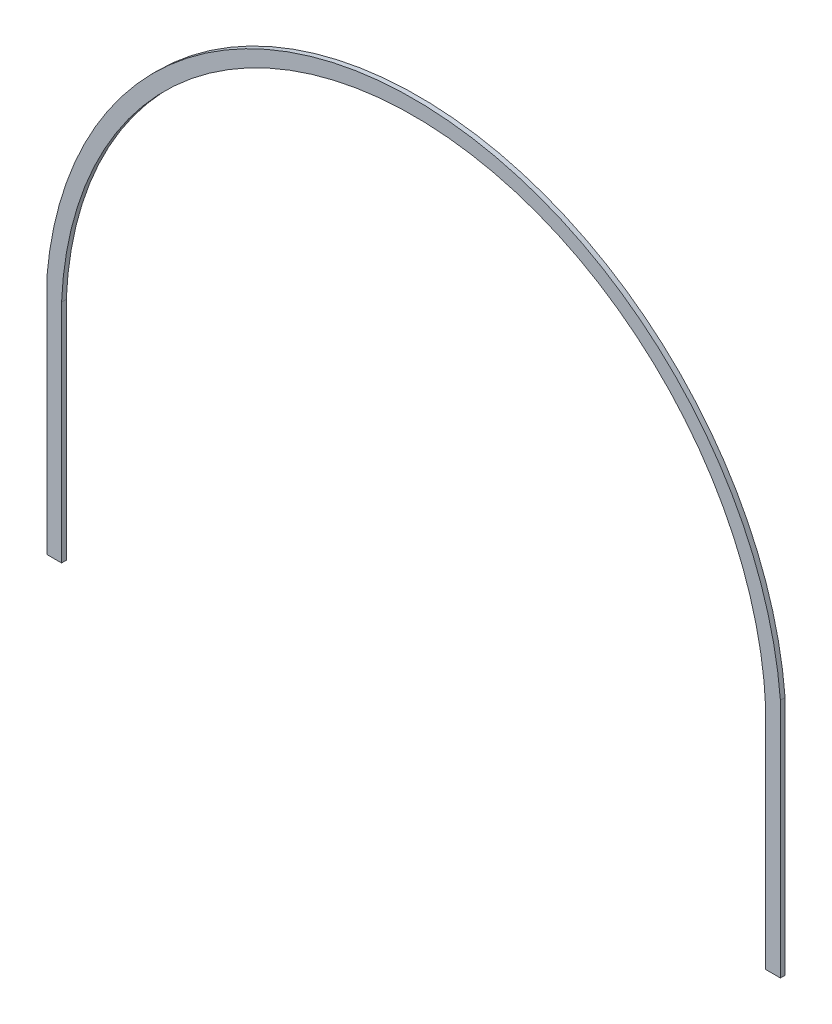
ISO-10303-21;
HEADER;
FILE_DESCRIPTION(('STEP AP214'),'2;1');
FILE_NAME('part.step','',(''),(''),'','','');
FILE_SCHEMA(('AUTOMOTIVE_DESIGN { 1 0 10303 214 1 1 1 1 }'));
ENDSEC;
DATA;
#1=APPLICATION_CONTEXT('core data for automotive mechanical design processes');
#2=APPLICATION_PROTOCOL_DEFINITION('international standard','automotive_design',2000,#1);
#3=PRODUCT_CONTEXT('',#1,'mechanical');
#4=PRODUCT('Part','Part','',(#3));
#5=PRODUCT_RELATED_PRODUCT_CATEGORY('part','',(#4));
#6=PRODUCT_DEFINITION_FORMATION('','',#4);
#7=PRODUCT_DEFINITION_CONTEXT('part definition',#1,'design');
#8=PRODUCT_DEFINITION('design','',#6,#7);
#9=PRODUCT_DEFINITION_SHAPE('','',#8);
#10=(LENGTH_UNIT() NAMED_UNIT(*) SI_UNIT(.MILLI.,.METRE.));
#11=(NAMED_UNIT(*) PLANE_ANGLE_UNIT() SI_UNIT($,.RADIAN.));
#12=(NAMED_UNIT(*) SI_UNIT($,.STERADIAN.) SOLID_ANGLE_UNIT());
#13=UNCERTAINTY_MEASURE_WITH_UNIT(LENGTH_MEASURE(1.E-05),#10,'distance_accuracy_value','');
#14=(GEOMETRIC_REPRESENTATION_CONTEXT(3) GLOBAL_UNCERTAINTY_ASSIGNED_CONTEXT((#13)) GLOBAL_UNIT_ASSIGNED_CONTEXT((#10,
#11,#12)) REPRESENTATION_CONTEXT('',''));
#15=CARTESIAN_POINT('',(0.,0.,0.));
#16=DIRECTION('',(0.,0.,1.));
#17=DIRECTION('',(1.,0.,0.));
#18=AXIS2_PLACEMENT_3D('',#15,#16,#17);
#19=CARTESIAN_POINT('',(0.,0.,1.6));
#20=DIRECTION('',(1.,0.,0.));
#21=DIRECTION('',(0.,0.,-1.));
#22=AXIS2_PLACEMENT_3D('',#19,#20,#21);
#23=PLANE('',#22);
#24=DIRECTION('',(0.,-1.,0.));
#25=VECTOR('',#24,1.);
#26=CARTESIAN_POINT('',(0.,0.,0.));
#27=LINE('',#26,#25);
#28=CARTESIAN_POINT('',(0.,82.,0.));
#29=VERTEX_POINT('',#28);
#30=CARTESIAN_POINT('',(0.,0.,0.));
#31=VERTEX_POINT('',#30);
#32=EDGE_CURVE('E142',#29,#31,#27,.T.);
#33=ORIENTED_EDGE('',*,*,#32,.T.);
#34=DIRECTION('',(0.,0.,-1.));
#35=VECTOR('',#34,1.);
#36=CARTESIAN_POINT('',(0.,0.,1.6));
#37=LINE('',#36,#35);
#38=CARTESIAN_POINT('',(0.,0.,1.6));
#39=VERTEX_POINT('',#38);
#40=EDGE_CURVE('E11',#39,#31,#37,.T.);
#41=ORIENTED_EDGE('',*,*,#40,.F.);
#42=DIRECTION('',(0.,-1.,0.));
#43=VECTOR('',#42,1.);
#44=CARTESIAN_POINT('',(0.,0.,1.6));
#45=LINE('',#44,#43);
#46=CARTESIAN_POINT('',(0.,82.,1.6));
#47=VERTEX_POINT('',#46);
#48=EDGE_CURVE('E164',#47,#39,#45,.T.);
#49=ORIENTED_EDGE('',*,*,#48,.F.);
#50=DIRECTION('',(0.,0.,-1.));
#51=VECTOR('',#50,1.);
#52=CARTESIAN_POINT('',(0.,82.,1.6));
#53=LINE('',#52,#51);
#54=EDGE_CURVE('E138',#47,#29,#53,.T.);
#55=ORIENTED_EDGE('',*,*,#54,.T.);
#56=EDGE_LOOP('',(#33,#41,#49,#55));
#57=FACE_BOUND('',#56,.T.);
#58=ADVANCED_FACE('F40',(#57),#23,.F.);
#59=CARTESIAN_POINT('',(0.,0.,1.6));
#60=DIRECTION('',(0.,1.,0.));
#61=DIRECTION('',(0.,0.,1.));
#62=AXIS2_PLACEMENT_3D('',#59,#60,#61);
#63=PLANE('',#62);
#64=DIRECTION('',(1.,0.,0.));
#65=VECTOR('',#64,1.);
#66=CARTESIAN_POINT('',(0.,0.,0.));
#67=LINE('',#66,#65);
#68=CARTESIAN_POINT('',(5.,0.,0.));
#69=VERTEX_POINT('',#68);
#70=EDGE_CURVE('E146',#31,#69,#67,.T.);
#71=ORIENTED_EDGE('',*,*,#70,.T.);
#72=DIRECTION('',(0.,0.,-1.));
#73=VECTOR('',#72,1.);
#74=CARTESIAN_POINT('',(5.,0.,1.6));
#75=LINE('',#74,#73);
#76=CARTESIAN_POINT('',(5.,0.,1.6));
#77=VERTEX_POINT('',#76);
#78=EDGE_CURVE('E49',#77,#69,#75,.T.);
#79=ORIENTED_EDGE('',*,*,#78,.F.);
#80=DIRECTION('',(1.,0.,0.));
#81=VECTOR('',#80,1.);
#82=CARTESIAN_POINT('',(0.,0.,1.6));
#83=LINE('',#82,#81);
#84=EDGE_CURVE('E100',#39,#77,#83,.T.);
#85=ORIENTED_EDGE('',*,*,#84,.F.);
#86=ORIENTED_EDGE('',*,*,#40,.T.);
#87=EDGE_LOOP('',(#71,#79,#85,#86));
#88=FACE_BOUND('',#87,.T.);
#89=ADVANCED_FACE('F214',(#88),#63,.F.);
#90=CARTESIAN_POINT('',(5.,0.,1.6));
#91=DIRECTION('',(-1.,0.,0.));
#92=DIRECTION('',(0.,-1.,0.));
#93=AXIS2_PLACEMENT_3D('',#90,#91,#92);
#94=PLANE('',#93);
#95=DIRECTION('',(0.,1.,0.));
#96=VECTOR('',#95,1.);
#97=CARTESIAN_POINT('',(5.,0.,0.));
#98=LINE('',#97,#96);
#99=CARTESIAN_POINT('',(5.,77.,0.));
#100=VERTEX_POINT('',#99);
#101=EDGE_CURVE('E149',#69,#100,#98,.T.);
#102=ORIENTED_EDGE('',*,*,#101,.T.);
#103=DIRECTION('',(0.,0.,-1.));
#104=VECTOR('',#103,1.);
#105=CARTESIAN_POINT('',(5.,77.,1.6));
#106=LINE('',#105,#104);
#107=CARTESIAN_POINT('',(5.,77.,1.6));
#108=VERTEX_POINT('',#107);
#109=EDGE_CURVE('E175',#108,#100,#106,.T.);
#110=ORIENTED_EDGE('',*,*,#109,.F.);
#111=DIRECTION('',(0.,1.,0.));
#112=VECTOR('',#111,1.);
#113=CARTESIAN_POINT('',(5.,0.,1.6));
#114=LINE('',#113,#112);
#115=EDGE_CURVE('E186',#77,#108,#114,.T.);
#116=ORIENTED_EDGE('',*,*,#115,.F.);
#117=ORIENTED_EDGE('',*,*,#78,.T.);
#118=EDGE_LOOP('',(#102,#110,#116,#117));
#119=FACE_BOUND('',#118,.T.);
#120=ADVANCED_FACE('F184',(#119),#94,.F.);
#121=CARTESIAN_POINT('',(125.,71.8913043478261,1.6));
#122=DIRECTION('',(0.,0.,-1.));
#123=DIRECTION('',(-1.,0.,0.));
#124=AXIS2_PLACEMENT_3D('',#121,#122,#123);
#125=CYLINDRICAL_SURFACE('',#124,120.108695652174);
#126=CARTESIAN_POINT('',(125.,71.8913043478261,0.));
#127=DIRECTION('',(0.,0.,-1.));
#128=DIRECTION('',(1.,0.,0.));
#129=AXIS2_PLACEMENT_3D('',#126,#127,#128);
#130=CIRCLE('',#129,120.108695652174);
#131=CARTESIAN_POINT('',(245.,77.,0.));
#132=VERTEX_POINT('',#131);
#133=EDGE_CURVE('E152',#100,#132,#130,.T.);
#134=ORIENTED_EDGE('',*,*,#133,.T.);
#135=DIRECTION('',(0.,0.,-1.));
#136=VECTOR('',#135,1.);
#137=CARTESIAN_POINT('',(245.,77.,1.6));
#138=LINE('',#137,#136);
#139=CARTESIAN_POINT('',(245.,77.,1.6));
#140=VERTEX_POINT('',#139);
#141=EDGE_CURVE('E171',#140,#132,#138,.T.);
#142=ORIENTED_EDGE('',*,*,#141,.F.);
#143=CARTESIAN_POINT('',(125.,71.8913043478261,1.6));
#144=DIRECTION('',(0.,0.,-1.));
#145=DIRECTION('',(1.,0.,0.));
#146=AXIS2_PLACEMENT_3D('',#143,#144,#145);
#147=CIRCLE('',#146,120.108695652174);
#148=EDGE_CURVE('E199',#108,#140,#147,.T.);
#149=ORIENTED_EDGE('',*,*,#148,.F.);
#150=ORIENTED_EDGE('',*,*,#109,.T.);
#151=EDGE_LOOP('',(#134,#142,#149,#150));
#152=FACE_BOUND('',#151,.T.);
#153=ADVANCED_FACE('F194',(#152),#125,.F.);
#154=CARTESIAN_POINT('',(245.,0.,1.6));
#155=DIRECTION('',(1.,0.,0.));
#156=DIRECTION('',(0.,0.,-1.));
#157=AXIS2_PLACEMENT_3D('',#154,#155,#156);
#158=PLANE('',#157);
#159=DIRECTION('',(0.,-1.,0.));
#160=VECTOR('',#159,1.);
#161=CARTESIAN_POINT('',(245.,0.,0.));
#162=LINE('',#161,#160);
#163=CARTESIAN_POINT('',(245.,0.,0.));
#164=VERTEX_POINT('',#163);
#165=EDGE_CURVE('E155',#132,#164,#162,.T.);
#166=ORIENTED_EDGE('',*,*,#165,.T.);
#167=DIRECTION('',(0.,0.,-1.));
#168=VECTOR('',#167,1.);
#169=CARTESIAN_POINT('',(245.,0.,1.6));
#170=LINE('',#169,#168);
#171=CARTESIAN_POINT('',(245.,0.,1.6));
#172=VERTEX_POINT('',#171);
#173=EDGE_CURVE('E130',#172,#164,#170,.T.);
#174=ORIENTED_EDGE('',*,*,#173,.F.);
#175=DIRECTION('',(0.,-1.,0.));
#176=VECTOR('',#175,1.);
#177=CARTESIAN_POINT('',(245.,0.,1.6));
#178=LINE('',#177,#176);
#179=EDGE_CURVE('E119',#140,#172,#178,.T.);
#180=ORIENTED_EDGE('',*,*,#179,.F.);
#181=ORIENTED_EDGE('',*,*,#141,.T.);
#182=EDGE_LOOP('',(#166,#174,#180,#181));
#183=FACE_BOUND('',#182,.T.);
#184=ADVANCED_FACE('F197',(#183),#158,.F.);
#185=CARTESIAN_POINT('',(250.,0.,1.6));
#186=DIRECTION('',(0.,1.,0.));
#187=DIRECTION('',(0.,0.,1.));
#188=AXIS2_PLACEMENT_3D('',#185,#186,#187);
#189=PLANE('',#188);
#190=DIRECTION('',(1.,0.,0.));
#191=VECTOR('',#190,1.);
#192=CARTESIAN_POINT('',(250.,0.,0.));
#193=LINE('',#192,#191);
#194=CARTESIAN_POINT('',(250.,0.,0.));
#195=VERTEX_POINT('',#194);
#196=EDGE_CURVE('E128',#164,#195,#193,.T.);
#197=ORIENTED_EDGE('',*,*,#196,.T.);
#198=DIRECTION('',(0.,0.,-1.));
#199=VECTOR('',#198,1.);
#200=CARTESIAN_POINT('',(250.,0.,1.6));
#201=LINE('',#200,#199);
#202=CARTESIAN_POINT('',(250.,0.,1.6));
#203=VERTEX_POINT('',#202);
#204=EDGE_CURVE('E125',#203,#195,#201,.T.);
#205=ORIENTED_EDGE('',*,*,#204,.F.);
#206=DIRECTION('',(1.,0.,0.));
#207=VECTOR('',#206,1.);
#208=CARTESIAN_POINT('',(250.,0.,1.6));
#209=LINE('',#208,#207);
#210=EDGE_CURVE('E113',#172,#203,#209,.T.);
#211=ORIENTED_EDGE('',*,*,#210,.F.);
#212=ORIENTED_EDGE('',*,*,#173,.T.);
#213=EDGE_LOOP('',(#197,#205,#211,#212));
#214=FACE_BOUND('',#213,.T.);
#215=ADVANCED_FACE('F126',(#214),#189,.F.);
#216=CARTESIAN_POINT('',(250.,0.,1.6));
#217=DIRECTION('',(-1.,0.,0.));
#218=DIRECTION('',(0.,0.,1.));
#219=AXIS2_PLACEMENT_3D('',#216,#217,#218);
#220=PLANE('',#219);
#221=DIRECTION('',(0.,1.,0.));
#222=VECTOR('',#221,1.);
#223=CARTESIAN_POINT('',(250.,0.,0.));
#224=LINE('',#223,#222);
#225=CARTESIAN_POINT('',(250.,82.,0.));
#226=VERTEX_POINT('',#225);
#227=EDGE_CURVE('E86',#195,#226,#224,.T.);
#228=ORIENTED_EDGE('',*,*,#227,.T.);
#229=DIRECTION('',(0.,0.,-1.));
#230=VECTOR('',#229,1.);
#231=CARTESIAN_POINT('',(250.,82.,1.6));
#232=LINE('',#231,#230);
#233=CARTESIAN_POINT('',(250.,82.,1.6));
#234=VERTEX_POINT('',#233);
#235=EDGE_CURVE('E131',#234,#226,#232,.T.);
#236=ORIENTED_EDGE('',*,*,#235,.F.);
#237=DIRECTION('',(0.,1.,0.));
#238=VECTOR('',#237,1.);
#239=CARTESIAN_POINT('',(250.,0.,1.6));
#240=LINE('',#239,#238);
#241=EDGE_CURVE('E117',#203,#234,#240,.T.);
#242=ORIENTED_EDGE('',*,*,#241,.F.);
#243=ORIENTED_EDGE('',*,*,#204,.T.);
#244=EDGE_LOOP('',(#228,#236,#242,#243));
#245=FACE_BOUND('',#244,.T.);
#246=ADVANCED_FACE('F133',(#245),#220,.F.);
#247=CARTESIAN_POINT('',(125.,71.5652173913044,1.6));
#248=DIRECTION('',(0.,0.,-1.));
#249=DIRECTION('',(-1.,0.,0.));
#250=AXIS2_PLACEMENT_3D('',#247,#248,#249);
#251=CYLINDRICAL_SURFACE('',#250,125.434782608696);
#252=CARTESIAN_POINT('',(125.,71.5652173913044,0.));
#253=DIRECTION('',(0.,0.,1.));
#254=DIRECTION('',(-1.,0.,0.));
#255=AXIS2_PLACEMENT_3D('',#252,#253,#254);
#256=CIRCLE('',#255,125.434782608696);
#257=EDGE_CURVE('E92',#226,#29,#256,.T.);
#258=ORIENTED_EDGE('',*,*,#257,.T.);
#259=ORIENTED_EDGE('',*,*,#54,.F.);
#260=CARTESIAN_POINT('',(125.,71.5652173913044,1.6));
#261=DIRECTION('',(0.,0.,1.));
#262=DIRECTION('',(-1.,0.,0.));
#263=AXIS2_PLACEMENT_3D('',#260,#261,#262);
#264=CIRCLE('',#263,125.434782608696);
#265=EDGE_CURVE('E57',#234,#47,#264,.T.);
#266=ORIENTED_EDGE('',*,*,#265,.F.);
#267=ORIENTED_EDGE('',*,*,#235,.T.);
#268=EDGE_LOOP('',(#258,#259,#266,#267));
#269=FACE_BOUND('',#268,.T.);
#270=ADVANCED_FACE('F230',(#269),#251,.T.);
#271=CARTESIAN_POINT('',(125.,71.5652173913044,1.6));
#272=DIRECTION('',(0.,0.,-1.));
#273=DIRECTION('',(-1.,0.,0.));
#274=AXIS2_PLACEMENT_3D('',#271,#272,#273);
#275=PLANE('',#274);
#276=ORIENTED_EDGE('',*,*,#48,.T.);
#277=ORIENTED_EDGE('',*,*,#84,.T.);
#278=ORIENTED_EDGE('',*,*,#115,.T.);
#279=ORIENTED_EDGE('',*,*,#148,.T.);
#280=ORIENTED_EDGE('',*,*,#179,.T.);
#281=ORIENTED_EDGE('',*,*,#210,.T.);
#282=ORIENTED_EDGE('',*,*,#241,.T.);
#283=ORIENTED_EDGE('',*,*,#265,.T.);
#284=EDGE_LOOP('',(#276,#277,#278,#279,#280,#281,#282,#283));
#285=FACE_BOUND('',#284,.T.);
#286=ADVANCED_FACE('F115',(#285),#275,.F.);
#287=CARTESIAN_POINT('',(125.,71.5652173913044,0.));
#288=DIRECTION('',(0.,0.,-1.));
#289=DIRECTION('',(-1.,0.,0.));
#290=AXIS2_PLACEMENT_3D('',#287,#288,#289);
#291=PLANE('',#290);
#292=ORIENTED_EDGE('',*,*,#32,.F.);
#293=ORIENTED_EDGE('',*,*,#257,.F.);
#294=ORIENTED_EDGE('',*,*,#227,.F.);
#295=ORIENTED_EDGE('',*,*,#196,.F.);
#296=ORIENTED_EDGE('',*,*,#165,.F.);
#297=ORIENTED_EDGE('',*,*,#133,.F.);
#298=ORIENTED_EDGE('',*,*,#101,.F.);
#299=ORIENTED_EDGE('',*,*,#70,.F.);
#300=EDGE_LOOP('',(#292,#293,#294,#295,#296,#297,#298,#299));
#301=FACE_BOUND('',#300,.T.);
#302=ADVANCED_FACE('F190',(#301),#291,.T.);
#303=CLOSED_SHELL('',(#58,#89,#120,#153,#184,#215,#246,#270,#286,#302));
#304=MANIFOLD_SOLID_BREP('B2',#303);
#305=ADVANCED_BREP_SHAPE_REPRESENTATION('',(#18,#304),#14);
#306=SHAPE_DEFINITION_REPRESENTATION(#9,#305);
ENDSEC;
END-ISO-10303-21;
